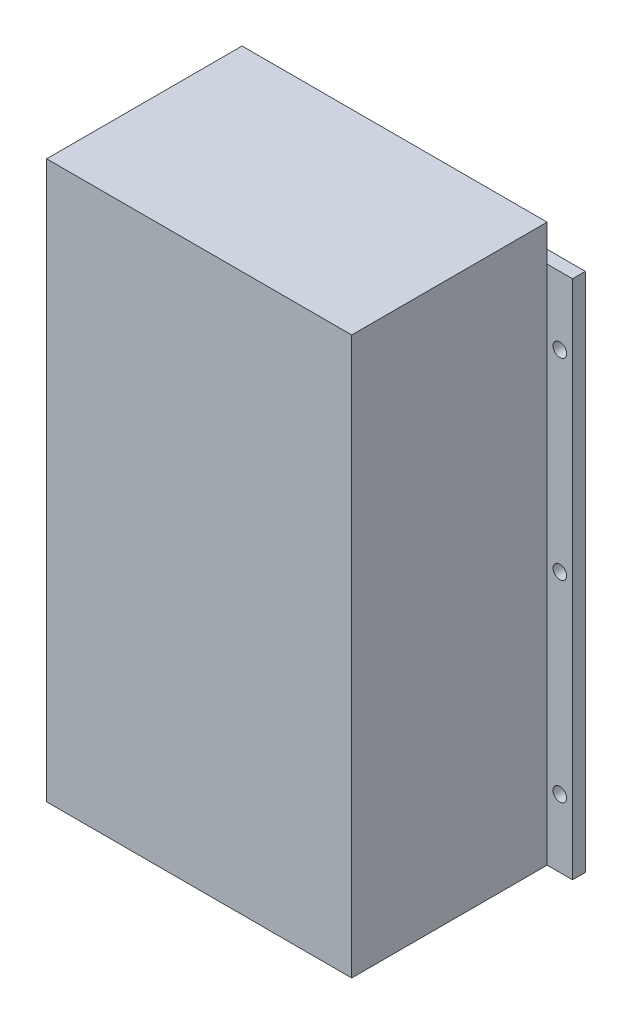
ISO-10303-21;
HEADER;
FILE_DESCRIPTION(('STEP AP214'),'2;1');
FILE_NAME('part.step','',(''),(''),'','','');
FILE_SCHEMA(('AUTOMOTIVE_DESIGN { 1 0 10303 214 1 1 1 1 }'));
ENDSEC;
DATA;
#1=APPLICATION_CONTEXT('core data for automotive mechanical design processes');
#2=APPLICATION_PROTOCOL_DEFINITION('international standard','automotive_design',2000,#1);
#3=PRODUCT_CONTEXT('',#1,'mechanical');
#4=PRODUCT('Part','Part','',(#3));
#5=PRODUCT_RELATED_PRODUCT_CATEGORY('part','',(#4));
#6=PRODUCT_DEFINITION_FORMATION('','',#4);
#7=PRODUCT_DEFINITION_CONTEXT('part definition',#1,'design');
#8=PRODUCT_DEFINITION('design','',#6,#7);
#9=PRODUCT_DEFINITION_SHAPE('','',#8);
#10=(LENGTH_UNIT() NAMED_UNIT(*) SI_UNIT(.MILLI.,.METRE.));
#11=(NAMED_UNIT(*) PLANE_ANGLE_UNIT() SI_UNIT($,.RADIAN.));
#12=(NAMED_UNIT(*) SI_UNIT($,.STERADIAN.) SOLID_ANGLE_UNIT());
#13=UNCERTAINTY_MEASURE_WITH_UNIT(LENGTH_MEASURE(1.E-05),#10,'distance_accuracy_value','');
#14=(GEOMETRIC_REPRESENTATION_CONTEXT(3) GLOBAL_UNCERTAINTY_ASSIGNED_CONTEXT((#13)) GLOBAL_UNIT_ASSIGNED_CONTEXT((#10,
#11,#12)) REPRESENTATION_CONTEXT('',''));
#15=CARTESIAN_POINT('',(0.,0.,0.));
#16=DIRECTION('',(0.,0.,1.));
#17=DIRECTION('',(1.,0.,0.));
#18=AXIS2_PLACEMENT_3D('',#15,#16,#17);
#19=CARTESIAN_POINT('',(0.,215.,86.));
#20=DIRECTION('',(0.,-1.,0.));
#21=DIRECTION('',(0.,0.,-1.));
#22=AXIS2_PLACEMENT_3D('',#19,#20,#21);
#23=PLANE('',#22);
#24=DIRECTION('',(-1.,0.,0.));
#25=VECTOR('',#24,1.);
#26=CARTESIAN_POINT('',(0.,215.,5.3));
#27=LINE('',#26,#25);
#28=CARTESIAN_POINT('',(126.,215.,5.3));
#29=VERTEX_POINT('',#28);
#30=CARTESIAN_POINT('',(0.,215.,5.3));
#31=VERTEX_POINT('',#30);
#32=EDGE_CURVE('E136',#29,#31,#27,.T.);
#33=ORIENTED_EDGE('',*,*,#32,.F.);
#34=DIRECTION('',(1.,0.,0.));
#35=VECTOR('',#34,1.);
#36=CARTESIAN_POINT('',(-10.5,215.,5.3));
#37=LINE('',#36,#35);
#38=CARTESIAN_POINT('',(136.5,215.,5.3));
#39=VERTEX_POINT('',#38);
#40=EDGE_CURVE('E233',#29,#39,#37,.T.);
#41=ORIENTED_EDGE('',*,*,#40,.T.);
#42=DIRECTION('',(0.,0.,1.));
#43=VECTOR('',#42,1.);
#44=CARTESIAN_POINT('',(136.5,215.,0.));
#45=LINE('',#44,#43);
#46=CARTESIAN_POINT('',(136.5,215.,0.));
#47=VERTEX_POINT('',#46);
#48=EDGE_CURVE('E205',#47,#39,#45,.T.);
#49=ORIENTED_EDGE('',*,*,#48,.F.);
#50=DIRECTION('',(-1.,0.,0.));
#51=VECTOR('',#50,1.);
#52=CARTESIAN_POINT('',(0.,215.,0.));
#53=LINE('',#52,#51);
#54=CARTESIAN_POINT('',(-10.5,215.,0.));
#55=VERTEX_POINT('',#54);
#56=EDGE_CURVE('E119',#47,#55,#53,.T.);
#57=ORIENTED_EDGE('',*,*,#56,.T.);
#58=DIRECTION('',(0.,0.,1.));
#59=VECTOR('',#58,1.);
#60=CARTESIAN_POINT('',(-10.5,215.,0.));
#61=LINE('',#60,#59);
#62=CARTESIAN_POINT('',(-10.5,215.,5.3));
#63=VERTEX_POINT('',#62);
#64=EDGE_CURVE('E221',#55,#63,#61,.T.);
#65=ORIENTED_EDGE('',*,*,#64,.T.);
#66=EDGE_CURVE('E240',#63,#31,#37,.T.);
#67=ORIENTED_EDGE('',*,*,#66,.T.);
#68=EDGE_LOOP('',(#33,#41,#49,#57,#65,#67));
#69=FACE_BOUND('',#68,.T.);
#70=ADVANCED_FACE('F43',(#69),#23,.F.);
#71=CARTESIAN_POINT('',(0.,0.,86.));
#72=DIRECTION('',(1.,0.,0.));
#73=DIRECTION('',(0.,0.,-1.));
#74=AXIS2_PLACEMENT_3D('',#71,#72,#73);
#75=PLANE('',#74);
#76=DIRECTION('',(0.,-1.,0.));
#77=VECTOR('',#76,1.);
#78=CARTESIAN_POINT('',(0.,0.,86.));
#79=LINE('',#78,#77);
#80=CARTESIAN_POINT('',(0.,230.,86.));
#81=VERTEX_POINT('',#80);
#82=CARTESIAN_POINT('',(0.,0.,86.));
#83=VERTEX_POINT('',#82);
#84=EDGE_CURVE('E114',#81,#83,#79,.T.);
#85=ORIENTED_EDGE('',*,*,#84,.F.);
#86=DIRECTION('',(0.,0.,1.));
#87=VECTOR('',#86,1.);
#88=CARTESIAN_POINT('',(0.,230.,5.3));
#89=LINE('',#88,#87);
#90=CARTESIAN_POINT('',(0.,230.,5.3));
#91=VERTEX_POINT('',#90);
#92=EDGE_CURVE('E117',#91,#81,#89,.T.);
#93=ORIENTED_EDGE('',*,*,#92,.F.);
#94=DIRECTION('',(0.,-1.,0.));
#95=VECTOR('',#94,1.);
#96=CARTESIAN_POINT('',(0.,230.,5.3));
#97=LINE('',#96,#95);
#98=EDGE_CURVE('E145',#91,#31,#97,.T.);
#99=ORIENTED_EDGE('',*,*,#98,.T.);
#100=DIRECTION('',(0.,-1.,0.));
#101=VECTOR('',#100,1.);
#102=CARTESIAN_POINT('',(0.,0.,5.29999999999997));
#103=LINE('',#102,#101);
#104=CARTESIAN_POINT('',(0.,0.,5.29999999999997));
#105=VERTEX_POINT('',#104);
#106=EDGE_CURVE('E59',#31,#105,#103,.T.);
#107=ORIENTED_EDGE('',*,*,#106,.T.);
#108=DIRECTION('',(0.,0.,-1.));
#109=VECTOR('',#108,1.);
#110=CARTESIAN_POINT('',(0.,0.,86.));
#111=LINE('',#110,#109);
#112=EDGE_CURVE('E11',#83,#105,#111,.T.);
#113=ORIENTED_EDGE('',*,*,#112,.F.);
#114=EDGE_LOOP('',(#85,#93,#99,#107,#113));
#115=FACE_BOUND('',#114,.T.);
#116=ADVANCED_FACE('F45',(#115),#75,.F.);
#117=CARTESIAN_POINT('',(0.,0.,86.));
#118=DIRECTION('',(0.,1.,0.));
#119=DIRECTION('',(0.,0.,1.));
#120=AXIS2_PLACEMENT_3D('',#117,#118,#119);
#121=PLANE('',#120);
#122=ORIENTED_EDGE('',*,*,#112,.T.);
#123=DIRECTION('',(1.,0.,0.));
#124=VECTOR('',#123,1.);
#125=CARTESIAN_POINT('',(-10.5,0.,5.29999999999997));
#126=LINE('',#125,#124);
#127=CARTESIAN_POINT('',(-10.5,0.,5.29999999999997));
#128=VERTEX_POINT('',#127);
#129=EDGE_CURVE('E234',#128,#105,#126,.T.);
#130=ORIENTED_EDGE('',*,*,#129,.F.);
#131=DIRECTION('',(0.,0.,-1.));
#132=VECTOR('',#131,1.);
#133=CARTESIAN_POINT('',(-10.5,0.,0.));
#134=LINE('',#133,#132);
#135=CARTESIAN_POINT('',(-10.5,0.,0.));
#136=VERTEX_POINT('',#135);
#137=EDGE_CURVE('E229',#128,#136,#134,.T.);
#138=ORIENTED_EDGE('',*,*,#137,.T.);
#139=DIRECTION('',(1.,0.,0.));
#140=VECTOR('',#139,1.);
#141=CARTESIAN_POINT('',(0.,0.,0.));
#142=LINE('',#141,#140);
#143=CARTESIAN_POINT('',(136.5,0.,0.));
#144=VERTEX_POINT('',#143);
#145=EDGE_CURVE('E247',#136,#144,#142,.T.);
#146=ORIENTED_EDGE('',*,*,#145,.T.);
#147=DIRECTION('',(0.,0.,-1.));
#148=VECTOR('',#147,1.);
#149=CARTESIAN_POINT('',(136.5,0.,0.));
#150=LINE('',#149,#148);
#151=CARTESIAN_POINT('',(136.5,0.,5.29999999999997));
#152=VERTEX_POINT('',#151);
#153=EDGE_CURVE('E213',#152,#144,#150,.T.);
#154=ORIENTED_EDGE('',*,*,#153,.F.);
#155=CARTESIAN_POINT('',(126.,0.,5.29999999999997));
#156=VERTEX_POINT('',#155);
#157=EDGE_CURVE('E239',#156,#152,#126,.T.);
#158=ORIENTED_EDGE('',*,*,#157,.F.);
#159=DIRECTION('',(0.,0.,-1.));
#160=VECTOR('',#159,1.);
#161=CARTESIAN_POINT('',(126.,0.,86.));
#162=LINE('',#161,#160);
#163=CARTESIAN_POINT('',(126.,0.,86.));
#164=VERTEX_POINT('',#163);
#165=EDGE_CURVE('E52',#164,#156,#162,.T.);
#166=ORIENTED_EDGE('',*,*,#165,.F.);
#167=DIRECTION('',(1.,0.,0.));
#168=VECTOR('',#167,1.);
#169=CARTESIAN_POINT('',(0.,0.,86.));
#170=LINE('',#169,#168);
#171=EDGE_CURVE('E66',#83,#164,#170,.T.);
#172=ORIENTED_EDGE('',*,*,#171,.F.);
#173=EDGE_LOOP('',(#122,#130,#138,#146,#154,#158,#166,#172));
#174=FACE_BOUND('',#173,.T.);
#175=ADVANCED_FACE('F263',(#174),#121,.F.);
#176=CARTESIAN_POINT('',(126.,0.,86.));
#177=DIRECTION('',(-1.,0.,0.));
#178=DIRECTION('',(0.,0.,1.));
#179=AXIS2_PLACEMENT_3D('',#176,#177,#178);
#180=PLANE('',#179);
#181=ORIENTED_EDGE('',*,*,#165,.T.);
#182=DIRECTION('',(0.,1.,0.));
#183=VECTOR('',#182,1.);
#184=CARTESIAN_POINT('',(126.,0.,5.29999999999997));
#185=LINE('',#184,#183);
#186=EDGE_CURVE('E238',#156,#29,#185,.T.);
#187=ORIENTED_EDGE('',*,*,#186,.T.);
#188=DIRECTION('',(0.,-1.,0.));
#189=VECTOR('',#188,1.);
#190=CARTESIAN_POINT('',(126.,230.,5.3));
#191=LINE('',#190,#189);
#192=CARTESIAN_POINT('',(126.,230.,5.3));
#193=VERTEX_POINT('',#192);
#194=EDGE_CURVE('E149',#193,#29,#191,.T.);
#195=ORIENTED_EDGE('',*,*,#194,.F.);
#196=DIRECTION('',(0.,0.,-1.));
#197=VECTOR('',#196,1.);
#198=CARTESIAN_POINT('',(126.,230.,5.3));
#199=LINE('',#198,#197);
#200=CARTESIAN_POINT('',(126.,230.,86.));
#201=VERTEX_POINT('',#200);
#202=EDGE_CURVE('E129',#201,#193,#199,.T.);
#203=ORIENTED_EDGE('',*,*,#202,.F.);
#204=DIRECTION('',(0.,1.,0.));
#205=VECTOR('',#204,1.);
#206=CARTESIAN_POINT('',(126.,0.,86.));
#207=LINE('',#206,#205);
#208=EDGE_CURVE('E125',#164,#201,#207,.T.);
#209=ORIENTED_EDGE('',*,*,#208,.F.);
#210=EDGE_LOOP('',(#181,#187,#195,#203,#209));
#211=FACE_BOUND('',#210,.T.);
#212=ADVANCED_FACE('F259',(#211),#180,.F.);
#213=CARTESIAN_POINT('',(0.,0.,86.));
#214=DIRECTION('',(0.,0.,-1.));
#215=DIRECTION('',(-1.,0.,0.));
#216=AXIS2_PLACEMENT_3D('',#213,#214,#215);
#217=PLANE('',#216);
#218=ORIENTED_EDGE('',*,*,#84,.T.);
#219=ORIENTED_EDGE('',*,*,#171,.T.);
#220=ORIENTED_EDGE('',*,*,#208,.T.);
#221=DIRECTION('',(1.,0.,0.));
#222=VECTOR('',#221,1.);
#223=CARTESIAN_POINT('',(0.,230.,86.));
#224=LINE('',#223,#222);
#225=EDGE_CURVE('E122',#81,#201,#224,.T.);
#226=ORIENTED_EDGE('',*,*,#225,.F.);
#227=EDGE_LOOP('',(#218,#219,#220,#226));
#228=FACE_BOUND('',#227,.T.);
#229=ADVANCED_FACE('F123',(#228),#217,.F.);
#230=CARTESIAN_POINT('',(0.,0.,0.));
#231=DIRECTION('',(0.,0.,-1.));
#232=DIRECTION('',(-1.,0.,0.));
#233=AXIS2_PLACEMENT_3D('',#230,#231,#232);
#234=PLANE('',#233);
#235=CARTESIAN_POINT('',(-5.25,187.,0.));
#236=DIRECTION('',(0.,0.,-1.));
#237=DIRECTION('',(-1.,0.,0.));
#238=AXIS2_PLACEMENT_3D('',#235,#236,#237);
#239=CIRCLE('',#238,2.8);
#240=CARTESIAN_POINT('',(-2.45,187.,0.));
#241=VERTEX_POINT('',#240);
#242=EDGE_CURVE('E157',#241,#241,#239,.T.);
#243=ORIENTED_EDGE('',*,*,#242,.F.);
#244=EDGE_LOOP('',(#243));
#245=FACE_BOUND('',#244,.T.);
#246=CARTESIAN_POINT('',(-5.25,107.5,0.));
#247=DIRECTION('',(0.,0.,-1.));
#248=DIRECTION('',(-1.,0.,0.));
#249=AXIS2_PLACEMENT_3D('',#246,#247,#248);
#250=CIRCLE('',#249,2.8);
#251=CARTESIAN_POINT('',(-2.45,107.5,0.));
#252=VERTEX_POINT('',#251);
#253=EDGE_CURVE('E161',#252,#252,#250,.T.);
#254=ORIENTED_EDGE('',*,*,#253,.F.);
#255=EDGE_LOOP('',(#254));
#256=FACE_BOUND('',#255,.T.);
#257=CARTESIAN_POINT('',(-5.25,28.,0.));
#258=DIRECTION('',(0.,0.,-1.));
#259=DIRECTION('',(-1.,0.,0.));
#260=AXIS2_PLACEMENT_3D('',#257,#258,#259);
#261=CIRCLE('',#260,2.80000000000001);
#262=CARTESIAN_POINT('',(-2.45,28.,0.));
#263=VERTEX_POINT('',#262);
#264=EDGE_CURVE('E173',#263,#263,#261,.T.);
#265=ORIENTED_EDGE('',*,*,#264,.F.);
#266=EDGE_LOOP('',(#265));
#267=FACE_BOUND('',#266,.T.);
#268=CARTESIAN_POINT('',(131.25,187.,0.));
#269=DIRECTION('',(0.,0.,-1.));
#270=DIRECTION('',(-1.,0.,0.));
#271=AXIS2_PLACEMENT_3D('',#268,#269,#270);
#272=CIRCLE('',#271,2.8);
#273=CARTESIAN_POINT('',(134.05,187.,0.));
#274=VERTEX_POINT('',#273);
#275=EDGE_CURVE('E181',#274,#274,#272,.T.);
#276=ORIENTED_EDGE('',*,*,#275,.F.);
#277=EDGE_LOOP('',(#276));
#278=FACE_BOUND('',#277,.T.);
#279=CARTESIAN_POINT('',(131.25,107.5,0.));
#280=DIRECTION('',(0.,0.,-1.));
#281=DIRECTION('',(-1.,0.,0.));
#282=AXIS2_PLACEMENT_3D('',#279,#280,#281);
#283=CIRCLE('',#282,2.8);
#284=CARTESIAN_POINT('',(134.05,107.5,0.));
#285=VERTEX_POINT('',#284);
#286=EDGE_CURVE('E189',#285,#285,#283,.T.);
#287=ORIENTED_EDGE('',*,*,#286,.F.);
#288=EDGE_LOOP('',(#287));
#289=FACE_BOUND('',#288,.T.);
#290=CARTESIAN_POINT('',(131.25,28.,0.));
#291=DIRECTION('',(0.,0.,-1.));
#292=DIRECTION('',(-1.,0.,0.));
#293=AXIS2_PLACEMENT_3D('',#290,#291,#292);
#294=CIRCLE('',#293,2.80000000000001);
#295=CARTESIAN_POINT('',(134.05,28.,0.));
#296=VERTEX_POINT('',#295);
#297=EDGE_CURVE('E197',#296,#296,#294,.T.);
#298=ORIENTED_EDGE('',*,*,#297,.F.);
#299=EDGE_LOOP('',(#298));
#300=FACE_BOUND('',#299,.T.);
#301=ORIENTED_EDGE('',*,*,#145,.F.);
#302=DIRECTION('',(0.,1.,0.));
#303=VECTOR('',#302,1.);
#304=CARTESIAN_POINT('',(-10.5,215.,0.));
#305=LINE('',#304,#303);
#306=EDGE_CURVE('E217',#136,#55,#305,.T.);
#307=ORIENTED_EDGE('',*,*,#306,.T.);
#308=ORIENTED_EDGE('',*,*,#56,.F.);
#309=DIRECTION('',(0.,1.,0.));
#310=VECTOR('',#309,1.);
#311=CARTESIAN_POINT('',(136.5,215.,0.));
#312=LINE('',#311,#310);
#313=EDGE_CURVE('E201',#144,#47,#312,.T.);
#314=ORIENTED_EDGE('',*,*,#313,.F.);
#315=EDGE_LOOP('',(#301,#307,#308,#314));
#316=FACE_BOUND('',#315,.T.);
#317=ADVANCED_FACE('F286',(#245,#256,#267,#278,#289,#300,#316),#234,.T.);
#318=CARTESIAN_POINT('',(136.5,0.,0.));
#319=DIRECTION('',(-1.,0.,0.));
#320=DIRECTION('',(0.,0.,1.));
#321=AXIS2_PLACEMENT_3D('',#318,#319,#320);
#322=PLANE('',#321);
#323=ORIENTED_EDGE('',*,*,#313,.T.);
#324=ORIENTED_EDGE('',*,*,#48,.T.);
#325=DIRECTION('',(0.,-1.,0.));
#326=VECTOR('',#325,1.);
#327=CARTESIAN_POINT('',(136.5,215.,5.3));
#328=LINE('',#327,#326);
#329=EDGE_CURVE('E209',#39,#152,#328,.T.);
#330=ORIENTED_EDGE('',*,*,#329,.T.);
#331=ORIENTED_EDGE('',*,*,#153,.T.);
#332=EDGE_LOOP('',(#323,#324,#330,#331));
#333=FACE_BOUND('',#332,.T.);
#334=ADVANCED_FACE('F273',(#333),#322,.F.);
#335=CARTESIAN_POINT('',(-10.5,215.,5.3));
#336=DIRECTION('',(0.,0.,1.));
#337=DIRECTION('',(0.,-1.,0.));
#338=AXIS2_PLACEMENT_3D('',#335,#336,#337);
#339=PLANE('',#338);
#340=CARTESIAN_POINT('',(131.25,187.,5.29999999999997));
#341=DIRECTION('',(0.,0.,1.));
#342=DIRECTION('',(1.,0.,0.));
#343=AXIS2_PLACEMENT_3D('',#340,#341,#342);
#344=CIRCLE('',#343,2.8);
#345=CARTESIAN_POINT('',(134.05,187.,5.29999999999997));
#346=VERTEX_POINT('',#345);
#347=EDGE_CURVE('E177',#346,#346,#344,.T.);
#348=ORIENTED_EDGE('',*,*,#347,.F.);
#349=EDGE_LOOP('',(#348));
#350=FACE_BOUND('',#349,.T.);
#351=CARTESIAN_POINT('',(131.25,107.5,5.29999999999997));
#352=DIRECTION('',(0.,0.,1.));
#353=DIRECTION('',(1.,0.,0.));
#354=AXIS2_PLACEMENT_3D('',#351,#352,#353);
#355=CIRCLE('',#354,2.8);
#356=CARTESIAN_POINT('',(134.05,107.5,5.29999999999997));
#357=VERTEX_POINT('',#356);
#358=EDGE_CURVE('E185',#357,#357,#355,.T.);
#359=ORIENTED_EDGE('',*,*,#358,.F.);
#360=EDGE_LOOP('',(#359));
#361=FACE_BOUND('',#360,.T.);
#362=CARTESIAN_POINT('',(131.25,28.,5.29999999999997));
#363=DIRECTION('',(0.,0.,1.));
#364=DIRECTION('',(1.,0.,0.));
#365=AXIS2_PLACEMENT_3D('',#362,#363,#364);
#366=CIRCLE('',#365,2.80000000000001);
#367=CARTESIAN_POINT('',(134.05,28.,5.29999999999997));
#368=VERTEX_POINT('',#367);
#369=EDGE_CURVE('E193',#368,#368,#366,.T.);
#370=ORIENTED_EDGE('',*,*,#369,.F.);
#371=EDGE_LOOP('',(#370));
#372=FACE_BOUND('',#371,.T.);
#373=ORIENTED_EDGE('',*,*,#186,.F.);
#374=ORIENTED_EDGE('',*,*,#157,.T.);
#375=ORIENTED_EDGE('',*,*,#329,.F.);
#376=ORIENTED_EDGE('',*,*,#40,.F.);
#377=EDGE_LOOP('',(#373,#374,#375,#376));
#378=FACE_BOUND('',#377,.T.);
#379=ADVANCED_FACE('F275',(#350,#361,#372,#378),#339,.T.);
#380=CARTESIAN_POINT('',(-5.25,187.,5.29999999999997));
#381=DIRECTION('',(0.,0.,1.));
#382=DIRECTION('',(1.,0.,0.));
#383=AXIS2_PLACEMENT_3D('',#380,#381,#382);
#384=CIRCLE('',#383,2.8);
#385=CARTESIAN_POINT('',(-2.45,187.,5.29999999999997));
#386=VERTEX_POINT('',#385);
#387=EDGE_CURVE('E153',#386,#386,#384,.T.);
#388=ORIENTED_EDGE('',*,*,#387,.F.);
#389=EDGE_LOOP('',(#388));
#390=FACE_BOUND('',#389,.T.);
#391=CARTESIAN_POINT('',(-5.25,107.5,5.29999999999997));
#392=DIRECTION('',(0.,0.,1.));
#393=DIRECTION('',(1.,0.,0.));
#394=AXIS2_PLACEMENT_3D('',#391,#392,#393);
#395=CIRCLE('',#394,2.8);
#396=CARTESIAN_POINT('',(-2.45,107.5,5.29999999999997));
#397=VERTEX_POINT('',#396);
#398=EDGE_CURVE('E165',#397,#397,#395,.T.);
#399=ORIENTED_EDGE('',*,*,#398,.F.);
#400=EDGE_LOOP('',(#399));
#401=FACE_BOUND('',#400,.T.);
#402=CARTESIAN_POINT('',(-5.25,28.,5.29999999999997));
#403=DIRECTION('',(0.,0.,1.));
#404=DIRECTION('',(1.,0.,0.));
#405=AXIS2_PLACEMENT_3D('',#402,#403,#404);
#406=CIRCLE('',#405,2.80000000000001);
#407=CARTESIAN_POINT('',(-2.45,28.,5.29999999999997));
#408=VERTEX_POINT('',#407);
#409=EDGE_CURVE('E169',#408,#408,#406,.T.);
#410=ORIENTED_EDGE('',*,*,#409,.F.);
#411=EDGE_LOOP('',(#410));
#412=FACE_BOUND('',#411,.T.);
#413=ORIENTED_EDGE('',*,*,#106,.F.);
#414=ORIENTED_EDGE('',*,*,#66,.F.);
#415=DIRECTION('',(0.,-1.,0.));
#416=VECTOR('',#415,1.);
#417=CARTESIAN_POINT('',(-10.5,215.,5.3));
#418=LINE('',#417,#416);
#419=EDGE_CURVE('E225',#63,#128,#418,.T.);
#420=ORIENTED_EDGE('',*,*,#419,.T.);
#421=ORIENTED_EDGE('',*,*,#129,.T.);
#422=EDGE_LOOP('',(#413,#414,#420,#421));
#423=FACE_BOUND('',#422,.T.);
#424=ADVANCED_FACE('F277',(#390,#401,#412,#423),#339,.T.);
#425=CARTESIAN_POINT('',(-10.5,0.,0.));
#426=DIRECTION('',(-1.,0.,0.));
#427=DIRECTION('',(0.,0.,1.));
#428=AXIS2_PLACEMENT_3D('',#425,#426,#427);
#429=PLANE('',#428);
#430=ORIENTED_EDGE('',*,*,#306,.F.);
#431=ORIENTED_EDGE('',*,*,#137,.F.);
#432=ORIENTED_EDGE('',*,*,#419,.F.);
#433=ORIENTED_EDGE('',*,*,#64,.F.);
#434=EDGE_LOOP('',(#430,#431,#432,#433));
#435=FACE_BOUND('',#434,.T.);
#436=ADVANCED_FACE('F284',(#435),#429,.T.);
#437=CARTESIAN_POINT('',(131.25,28.,-5.20000000000003));
#438=DIRECTION('',(0.,0.,1.));
#439=DIRECTION('',(1.,0.,0.));
#440=AXIS2_PLACEMENT_3D('',#437,#438,#439);
#441=CYLINDRICAL_SURFACE('',#440,2.80000000000001);
#442=CARTESIAN_POINT('',(134.05,28.,0.));
#443=CARTESIAN_POINT('',(134.05,28.,0.055208333333333));
#444=CARTESIAN_POINT('',(134.05,28.,0.110416666666666));
#445=CARTESIAN_POINT('',(134.05,28.,0.220833333333332));
#446=CARTESIAN_POINT('',(134.05,28.,0.276041666666665));
#447=CARTESIAN_POINT('',(134.05,28.,0.386458333333331));
#448=CARTESIAN_POINT('',(134.05,28.,0.441666666666664));
#449=CARTESIAN_POINT('',(134.05,28.,0.55208333333333));
#450=CARTESIAN_POINT('',(134.05,28.,0.607291666666663));
#451=CARTESIAN_POINT('',(134.05,28.,0.71770833333333));
#452=CARTESIAN_POINT('',(134.05,28.,0.772916666666663));
#453=CARTESIAN_POINT('',(134.05,28.,0.883333333333329));
#454=CARTESIAN_POINT('',(134.05,28.,0.938541666666662));
#455=CARTESIAN_POINT('',(134.05,28.,1.04895833333333));
#456=CARTESIAN_POINT('',(134.05,28.,1.10416666666666));
#457=CARTESIAN_POINT('',(134.05,28.,1.21458333333333));
#458=CARTESIAN_POINT('',(134.05,28.,1.26979166666666));
#459=CARTESIAN_POINT('',(134.05,28.,1.38020833333333));
#460=CARTESIAN_POINT('',(134.05,28.,1.43541666666666));
#461=CARTESIAN_POINT('',(134.05,28.,1.54583333333333));
#462=CARTESIAN_POINT('',(134.05,28.,1.60104166666666));
#463=CARTESIAN_POINT('',(134.05,28.,1.71145833333333));
#464=CARTESIAN_POINT('',(134.05,28.,1.76666666666666));
#465=CARTESIAN_POINT('',(134.05,28.,1.87708333333332));
#466=CARTESIAN_POINT('',(134.05,28.,1.93229166666666));
#467=CARTESIAN_POINT('',(134.05,28.,2.04270833333332));
#468=CARTESIAN_POINT('',(134.05,28.,2.09791666666666));
#469=CARTESIAN_POINT('',(134.05,28.,2.20833333333332));
#470=CARTESIAN_POINT('',(134.05,28.,2.26354166666666));
#471=CARTESIAN_POINT('',(134.05,28.,2.37395833333332));
#472=CARTESIAN_POINT('',(134.05,28.,2.42916666666666));
#473=CARTESIAN_POINT('',(134.05,28.,2.53958333333332));
#474=CARTESIAN_POINT('',(134.05,28.,2.59479166666665));
#475=CARTESIAN_POINT('',(134.05,28.,2.70520833333332));
#476=CARTESIAN_POINT('',(134.05,28.,2.76041666666665));
#477=CARTESIAN_POINT('',(134.05,28.,2.87083333333332));
#478=CARTESIAN_POINT('',(134.05,28.,2.92604166666665));
#479=CARTESIAN_POINT('',(134.05,28.,3.03645833333332));
#480=CARTESIAN_POINT('',(134.05,28.,3.09166666666665));
#481=CARTESIAN_POINT('',(134.05,28.,3.20208333333332));
#482=CARTESIAN_POINT('',(134.05,28.,3.25729166666665));
#483=CARTESIAN_POINT('',(134.05,28.,3.36770833333332));
#484=CARTESIAN_POINT('',(134.05,28.,3.42291666666665));
#485=CARTESIAN_POINT('',(134.05,28.,3.53333333333332));
#486=CARTESIAN_POINT('',(134.05,28.,3.58854166666665));
#487=CARTESIAN_POINT('',(134.05,28.,3.69895833333332));
#488=CARTESIAN_POINT('',(134.05,28.,3.75416666666665));
#489=CARTESIAN_POINT('',(134.05,28.,3.86458333333331));
#490=CARTESIAN_POINT('',(134.05,28.,3.91979166666665));
#491=CARTESIAN_POINT('',(134.05,28.,4.03020833333331));
#492=CARTESIAN_POINT('',(134.05,28.,4.08541666666665));
#493=CARTESIAN_POINT('',(134.05,28.,4.19583333333331));
#494=CARTESIAN_POINT('',(134.05,28.,4.25104166666665));
#495=CARTESIAN_POINT('',(134.05,28.,4.36145833333331));
#496=CARTESIAN_POINT('',(134.05,28.,4.41666666666664));
#497=CARTESIAN_POINT('',(134.05,28.,4.52708333333331));
#498=CARTESIAN_POINT('',(134.05,28.,4.58229166666664));
#499=CARTESIAN_POINT('',(134.05,28.,4.69270833333331));
#500=CARTESIAN_POINT('',(134.05,28.,4.74791666666664));
#501=CARTESIAN_POINT('',(134.05,28.,4.85833333333331));
#502=CARTESIAN_POINT('',(134.05,28.,4.91354166666664));
#503=CARTESIAN_POINT('',(134.05,28.,5.02395833333331));
#504=CARTESIAN_POINT('',(134.05,28.,5.07916666666664));
#505=CARTESIAN_POINT('',(134.05,28.,5.18958333333331));
#506=CARTESIAN_POINT('',(134.05,28.,5.24479166666664));
#507=CARTESIAN_POINT('',(134.05,28.,5.29999999999997));
#508=B_SPLINE_CURVE_WITH_KNOTS('',3,(#442,#443,#444,#445,#446,#447,#448,#449,#450,#451,#452,
#453,#454,#455,#456,#457,#458,#459,#460,#461,#462,#463,#464,#465,#466,#467,#468,#469,#470,#471,
#472,#473,#474,#475,#476,#477,#478,#479,#480,#481,#482,#483,#484,#485,#486,#487,#488,#489,#490,
#491,#492,#493,#494,#495,#496,#497,#498,#499,#500,#501,#502,#503,#504,#505,#506,#507),
.UNSPECIFIED.,.F.,.F.,(4,2,2,2,2,2,2,2,2,2,2,2,2,2,2,2,2,2,2,2,2,2,2,2,2,2,2,2,2,2,2,2,4),(0.,
0.165624999999999,0.331249999999998,0.496874999999997,0.662499999999996,0.828124999999996,
0.993749999999995,1.15937499999999,1.32499999999999,1.49062499999999,1.65624999999999,
1.82187499999999,1.98749999999999,2.15312499999999,2.31874999999999,2.48437499999999,
2.64999999999999,2.81562499999999,2.98124999999998,3.14687499999998,3.31249999999998,
3.47812499999998,3.64374999999998,3.80937499999998,3.97499999999998,4.14062499999998,
4.30624999999998,4.47187499999998,4.63749999999998,4.80312499999998,4.96874999999998,
5.13437499999997,5.29999999999997),.UNSPECIFIED.);
#509=EDGE_CURVE('BSEAM337',#296,#368,#508,.T.);
#510=ORIENTED_EDGE('',*,*,#297,.T.);
#511=ORIENTED_EDGE('',*,*,#369,.T.);
#512=ORIENTED_EDGE('',*,*,#509,.T.);
#513=ORIENTED_EDGE('',*,*,#509,.F.);
#514=EDGE_LOOP('',(#510,#512,#511,#513));
#515=FACE_BOUND('',#514,.T.);
#516=ADVANCED_FACE('F337',(#515),#441,.F.);
#517=CARTESIAN_POINT('',(131.25,107.5,-5.20000000000003));
#518=DIRECTION('',(0.,0.,1.));
#519=DIRECTION('',(1.,0.,0.));
#520=AXIS2_PLACEMENT_3D('',#517,#518,#519);
#521=CYLINDRICAL_SURFACE('',#520,2.8);
#522=CARTESIAN_POINT('',(134.05,107.5,0.));
#523=CARTESIAN_POINT('',(134.05,107.5,0.055208333333333));
#524=CARTESIAN_POINT('',(134.05,107.5,0.110416666666666));
#525=CARTESIAN_POINT('',(134.05,107.5,0.220833333333332));
#526=CARTESIAN_POINT('',(134.05,107.5,0.276041666666665));
#527=CARTESIAN_POINT('',(134.05,107.5,0.386458333333331));
#528=CARTESIAN_POINT('',(134.05,107.5,0.441666666666664));
#529=CARTESIAN_POINT('',(134.05,107.5,0.55208333333333));
#530=CARTESIAN_POINT('',(134.05,107.5,0.607291666666663));
#531=CARTESIAN_POINT('',(134.05,107.5,0.71770833333333));
#532=CARTESIAN_POINT('',(134.05,107.5,0.772916666666663));
#533=CARTESIAN_POINT('',(134.05,107.5,0.883333333333329));
#534=CARTESIAN_POINT('',(134.05,107.5,0.938541666666662));
#535=CARTESIAN_POINT('',(134.05,107.5,1.04895833333333));
#536=CARTESIAN_POINT('',(134.05,107.5,1.10416666666666));
#537=CARTESIAN_POINT('',(134.05,107.5,1.21458333333333));
#538=CARTESIAN_POINT('',(134.05,107.5,1.26979166666666));
#539=CARTESIAN_POINT('',(134.05,107.5,1.38020833333333));
#540=CARTESIAN_POINT('',(134.05,107.5,1.43541666666666));
#541=CARTESIAN_POINT('',(134.05,107.5,1.54583333333333));
#542=CARTESIAN_POINT('',(134.05,107.5,1.60104166666666));
#543=CARTESIAN_POINT('',(134.05,107.5,1.71145833333333));
#544=CARTESIAN_POINT('',(134.05,107.5,1.76666666666666));
#545=CARTESIAN_POINT('',(134.05,107.5,1.87708333333332));
#546=CARTESIAN_POINT('',(134.05,107.5,1.93229166666666));
#547=CARTESIAN_POINT('',(134.05,107.5,2.04270833333332));
#548=CARTESIAN_POINT('',(134.05,107.5,2.09791666666666));
#549=CARTESIAN_POINT('',(134.05,107.5,2.20833333333332));
#550=CARTESIAN_POINT('',(134.05,107.5,2.26354166666666));
#551=CARTESIAN_POINT('',(134.05,107.5,2.37395833333332));
#552=CARTESIAN_POINT('',(134.05,107.5,2.42916666666666));
#553=CARTESIAN_POINT('',(134.05,107.5,2.53958333333332));
#554=CARTESIAN_POINT('',(134.05,107.5,2.59479166666665));
#555=CARTESIAN_POINT('',(134.05,107.5,2.70520833333332));
#556=CARTESIAN_POINT('',(134.05,107.5,2.76041666666665));
#557=CARTESIAN_POINT('',(134.05,107.5,2.87083333333332));
#558=CARTESIAN_POINT('',(134.05,107.5,2.92604166666665));
#559=CARTESIAN_POINT('',(134.05,107.5,3.03645833333332));
#560=CARTESIAN_POINT('',(134.05,107.5,3.09166666666665));
#561=CARTESIAN_POINT('',(134.05,107.5,3.20208333333332));
#562=CARTESIAN_POINT('',(134.05,107.5,3.25729166666665));
#563=CARTESIAN_POINT('',(134.05,107.5,3.36770833333332));
#564=CARTESIAN_POINT('',(134.05,107.5,3.42291666666665));
#565=CARTESIAN_POINT('',(134.05,107.5,3.53333333333332));
#566=CARTESIAN_POINT('',(134.05,107.5,3.58854166666665));
#567=CARTESIAN_POINT('',(134.05,107.5,3.69895833333332));
#568=CARTESIAN_POINT('',(134.05,107.5,3.75416666666665));
#569=CARTESIAN_POINT('',(134.05,107.5,3.86458333333331));
#570=CARTESIAN_POINT('',(134.05,107.5,3.91979166666665));
#571=CARTESIAN_POINT('',(134.05,107.5,4.03020833333331));
#572=CARTESIAN_POINT('',(134.05,107.5,4.08541666666665));
#573=CARTESIAN_POINT('',(134.05,107.5,4.19583333333331));
#574=CARTESIAN_POINT('',(134.05,107.5,4.25104166666665));
#575=CARTESIAN_POINT('',(134.05,107.5,4.36145833333331));
#576=CARTESIAN_POINT('',(134.05,107.5,4.41666666666664));
#577=CARTESIAN_POINT('',(134.05,107.5,4.52708333333331));
#578=CARTESIAN_POINT('',(134.05,107.5,4.58229166666664));
#579=CARTESIAN_POINT('',(134.05,107.5,4.69270833333331));
#580=CARTESIAN_POINT('',(134.05,107.5,4.74791666666664));
#581=CARTESIAN_POINT('',(134.05,107.5,4.85833333333331));
#582=CARTESIAN_POINT('',(134.05,107.5,4.91354166666664));
#583=CARTESIAN_POINT('',(134.05,107.5,5.02395833333331));
#584=CARTESIAN_POINT('',(134.05,107.5,5.07916666666664));
#585=CARTESIAN_POINT('',(134.05,107.5,5.18958333333331));
#586=CARTESIAN_POINT('',(134.05,107.5,5.24479166666664));
#587=CARTESIAN_POINT('',(134.05,107.5,5.29999999999997));
#588=B_SPLINE_CURVE_WITH_KNOTS('',3,(#522,#523,#524,#525,#526,#527,#528,#529,#530,#531,#532,
#533,#534,#535,#536,#537,#538,#539,#540,#541,#542,#543,#544,#545,#546,#547,#548,#549,#550,#551,
#552,#553,#554,#555,#556,#557,#558,#559,#560,#561,#562,#563,#564,#565,#566,#567,#568,#569,#570,
#571,#572,#573,#574,#575,#576,#577,#578,#579,#580,#581,#582,#583,#584,#585,#586,#587),
.UNSPECIFIED.,.F.,.F.,(4,2,2,2,2,2,2,2,2,2,2,2,2,2,2,2,2,2,2,2,2,2,2,2,2,2,2,2,2,2,2,2,4),(0.,
0.165624999999999,0.331249999999998,0.496874999999997,0.662499999999996,0.828124999999996,
0.993749999999995,1.15937499999999,1.32499999999999,1.49062499999999,1.65624999999999,
1.82187499999999,1.98749999999999,2.15312499999999,2.31874999999999,2.48437499999999,
2.64999999999999,2.81562499999999,2.98124999999998,3.14687499999998,3.31249999999998,
3.47812499999998,3.64374999999998,3.80937499999998,3.97499999999998,4.14062499999998,
4.30624999999998,4.47187499999998,4.63749999999998,4.80312499999998,4.96874999999998,
5.13437499999997,5.29999999999997),.UNSPECIFIED.);
#589=EDGE_CURVE('BSEAM348',#285,#357,#588,.T.);
#590=ORIENTED_EDGE('',*,*,#286,.T.);
#591=ORIENTED_EDGE('',*,*,#358,.T.);
#592=ORIENTED_EDGE('',*,*,#589,.T.);
#593=ORIENTED_EDGE('',*,*,#589,.F.);
#594=EDGE_LOOP('',(#590,#592,#591,#593));
#595=FACE_BOUND('',#594,.T.);
#596=ADVANCED_FACE('F348',(#595),#521,.F.);
#597=CARTESIAN_POINT('',(131.25,187.,-5.20000000000003));
#598=DIRECTION('',(0.,0.,1.));
#599=DIRECTION('',(1.,0.,0.));
#600=AXIS2_PLACEMENT_3D('',#597,#598,#599);
#601=CYLINDRICAL_SURFACE('',#600,2.8);
#602=CARTESIAN_POINT('',(134.05,187.,0.));
#603=CARTESIAN_POINT('',(134.05,187.,0.055208333333333));
#604=CARTESIAN_POINT('',(134.05,187.,0.110416666666666));
#605=CARTESIAN_POINT('',(134.05,187.,0.220833333333332));
#606=CARTESIAN_POINT('',(134.05,187.,0.276041666666665));
#607=CARTESIAN_POINT('',(134.05,187.,0.386458333333331));
#608=CARTESIAN_POINT('',(134.05,187.,0.441666666666664));
#609=CARTESIAN_POINT('',(134.05,187.,0.55208333333333));
#610=CARTESIAN_POINT('',(134.05,187.,0.607291666666663));
#611=CARTESIAN_POINT('',(134.05,187.,0.71770833333333));
#612=CARTESIAN_POINT('',(134.05,187.,0.772916666666663));
#613=CARTESIAN_POINT('',(134.05,187.,0.883333333333329));
#614=CARTESIAN_POINT('',(134.05,187.,0.938541666666662));
#615=CARTESIAN_POINT('',(134.05,187.,1.04895833333333));
#616=CARTESIAN_POINT('',(134.05,187.,1.10416666666666));
#617=CARTESIAN_POINT('',(134.05,187.,1.21458333333333));
#618=CARTESIAN_POINT('',(134.05,187.,1.26979166666666));
#619=CARTESIAN_POINT('',(134.05,187.,1.38020833333333));
#620=CARTESIAN_POINT('',(134.05,187.,1.43541666666666));
#621=CARTESIAN_POINT('',(134.05,187.,1.54583333333333));
#622=CARTESIAN_POINT('',(134.05,187.,1.60104166666666));
#623=CARTESIAN_POINT('',(134.05,187.,1.71145833333333));
#624=CARTESIAN_POINT('',(134.05,187.,1.76666666666666));
#625=CARTESIAN_POINT('',(134.05,187.,1.87708333333332));
#626=CARTESIAN_POINT('',(134.05,187.,1.93229166666666));
#627=CARTESIAN_POINT('',(134.05,187.,2.04270833333332));
#628=CARTESIAN_POINT('',(134.05,187.,2.09791666666666));
#629=CARTESIAN_POINT('',(134.05,187.,2.20833333333332));
#630=CARTESIAN_POINT('',(134.05,187.,2.26354166666666));
#631=CARTESIAN_POINT('',(134.05,187.,2.37395833333332));
#632=CARTESIAN_POINT('',(134.05,187.,2.42916666666666));
#633=CARTESIAN_POINT('',(134.05,187.,2.53958333333332));
#634=CARTESIAN_POINT('',(134.05,187.,2.59479166666665));
#635=CARTESIAN_POINT('',(134.05,187.,2.70520833333332));
#636=CARTESIAN_POINT('',(134.05,187.,2.76041666666665));
#637=CARTESIAN_POINT('',(134.05,187.,2.87083333333332));
#638=CARTESIAN_POINT('',(134.05,187.,2.92604166666665));
#639=CARTESIAN_POINT('',(134.05,187.,3.03645833333332));
#640=CARTESIAN_POINT('',(134.05,187.,3.09166666666665));
#641=CARTESIAN_POINT('',(134.05,187.,3.20208333333332));
#642=CARTESIAN_POINT('',(134.05,187.,3.25729166666665));
#643=CARTESIAN_POINT('',(134.05,187.,3.36770833333332));
#644=CARTESIAN_POINT('',(134.05,187.,3.42291666666665));
#645=CARTESIAN_POINT('',(134.05,187.,3.53333333333332));
#646=CARTESIAN_POINT('',(134.05,187.,3.58854166666665));
#647=CARTESIAN_POINT('',(134.05,187.,3.69895833333332));
#648=CARTESIAN_POINT('',(134.05,187.,3.75416666666665));
#649=CARTESIAN_POINT('',(134.05,187.,3.86458333333331));
#650=CARTESIAN_POINT('',(134.05,187.,3.91979166666665));
#651=CARTESIAN_POINT('',(134.05,187.,4.03020833333331));
#652=CARTESIAN_POINT('',(134.05,187.,4.08541666666665));
#653=CARTESIAN_POINT('',(134.05,187.,4.19583333333331));
#654=CARTESIAN_POINT('',(134.05,187.,4.25104166666665));
#655=CARTESIAN_POINT('',(134.05,187.,4.36145833333331));
#656=CARTESIAN_POINT('',(134.05,187.,4.41666666666664));
#657=CARTESIAN_POINT('',(134.05,187.,4.52708333333331));
#658=CARTESIAN_POINT('',(134.05,187.,4.58229166666664));
#659=CARTESIAN_POINT('',(134.05,187.,4.69270833333331));
#660=CARTESIAN_POINT('',(134.05,187.,4.74791666666664));
#661=CARTESIAN_POINT('',(134.05,187.,4.85833333333331));
#662=CARTESIAN_POINT('',(134.05,187.,4.91354166666664));
#663=CARTESIAN_POINT('',(134.05,187.,5.02395833333331));
#664=CARTESIAN_POINT('',(134.05,187.,5.07916666666664));
#665=CARTESIAN_POINT('',(134.05,187.,5.18958333333331));
#666=CARTESIAN_POINT('',(134.05,187.,5.24479166666664));
#667=CARTESIAN_POINT('',(134.05,187.,5.29999999999997));
#668=B_SPLINE_CURVE_WITH_KNOTS('',3,(#602,#603,#604,#605,#606,#607,#608,#609,#610,#611,#612,
#613,#614,#615,#616,#617,#618,#619,#620,#621,#622,#623,#624,#625,#626,#627,#628,#629,#630,#631,
#632,#633,#634,#635,#636,#637,#638,#639,#640,#641,#642,#643,#644,#645,#646,#647,#648,#649,#650,
#651,#652,#653,#654,#655,#656,#657,#658,#659,#660,#661,#662,#663,#664,#665,#666,#667),
.UNSPECIFIED.,.F.,.F.,(4,2,2,2,2,2,2,2,2,2,2,2,2,2,2,2,2,2,2,2,2,2,2,2,2,2,2,2,2,2,2,2,4),(0.,
0.165624999999999,0.331249999999998,0.496874999999997,0.662499999999996,0.828124999999996,
0.993749999999995,1.15937499999999,1.32499999999999,1.49062499999999,1.65624999999999,
1.82187499999999,1.98749999999999,2.15312499999999,2.31874999999999,2.48437499999999,
2.64999999999999,2.81562499999999,2.98124999999998,3.14687499999998,3.31249999999998,
3.47812499999998,3.64374999999998,3.80937499999998,3.97499999999998,4.14062499999998,
4.30624999999998,4.47187499999998,4.63749999999998,4.80312499999998,4.96874999999998,
5.13437499999997,5.29999999999997),.UNSPECIFIED.);
#669=EDGE_CURVE('BSEAM358',#274,#346,#668,.T.);
#670=ORIENTED_EDGE('',*,*,#275,.T.);
#671=ORIENTED_EDGE('',*,*,#347,.T.);
#672=ORIENTED_EDGE('',*,*,#669,.T.);
#673=ORIENTED_EDGE('',*,*,#669,.F.);
#674=EDGE_LOOP('',(#670,#672,#671,#673));
#675=FACE_BOUND('',#674,.T.);
#676=ADVANCED_FACE('F358',(#675),#601,.F.);
#677=CARTESIAN_POINT('',(-5.25,28.,-5.20000000000003));
#678=DIRECTION('',(0.,0.,1.));
#679=DIRECTION('',(1.,0.,0.));
#680=AXIS2_PLACEMENT_3D('',#677,#678,#679);
#681=CYLINDRICAL_SURFACE('',#680,2.80000000000001);
#682=CARTESIAN_POINT('',(-2.45,28.,0.));
#683=CARTESIAN_POINT('',(-2.45,28.,0.055208333333333));
#684=CARTESIAN_POINT('',(-2.45,28.,0.110416666666666));
#685=CARTESIAN_POINT('',(-2.45,28.,0.220833333333332));
#686=CARTESIAN_POINT('',(-2.45,28.,0.276041666666665));
#687=CARTESIAN_POINT('',(-2.45,28.,0.386458333333331));
#688=CARTESIAN_POINT('',(-2.45,28.,0.441666666666664));
#689=CARTESIAN_POINT('',(-2.45,28.,0.55208333333333));
#690=CARTESIAN_POINT('',(-2.45,28.,0.607291666666663));
#691=CARTESIAN_POINT('',(-2.45,28.,0.71770833333333));
#692=CARTESIAN_POINT('',(-2.45,28.,0.772916666666663));
#693=CARTESIAN_POINT('',(-2.45,28.,0.883333333333329));
#694=CARTESIAN_POINT('',(-2.45,28.,0.938541666666662));
#695=CARTESIAN_POINT('',(-2.45,28.,1.04895833333333));
#696=CARTESIAN_POINT('',(-2.45,28.,1.10416666666666));
#697=CARTESIAN_POINT('',(-2.45,28.,1.21458333333333));
#698=CARTESIAN_POINT('',(-2.45,28.,1.26979166666666));
#699=CARTESIAN_POINT('',(-2.45,28.,1.38020833333333));
#700=CARTESIAN_POINT('',(-2.45,28.,1.43541666666666));
#701=CARTESIAN_POINT('',(-2.45,28.,1.54583333333333));
#702=CARTESIAN_POINT('',(-2.45,28.,1.60104166666666));
#703=CARTESIAN_POINT('',(-2.45,28.,1.71145833333333));
#704=CARTESIAN_POINT('',(-2.45,28.,1.76666666666666));
#705=CARTESIAN_POINT('',(-2.45,28.,1.87708333333332));
#706=CARTESIAN_POINT('',(-2.45,28.,1.93229166666666));
#707=CARTESIAN_POINT('',(-2.45,28.,2.04270833333332));
#708=CARTESIAN_POINT('',(-2.45,28.,2.09791666666666));
#709=CARTESIAN_POINT('',(-2.45,28.,2.20833333333332));
#710=CARTESIAN_POINT('',(-2.45,28.,2.26354166666666));
#711=CARTESIAN_POINT('',(-2.45,28.,2.37395833333332));
#712=CARTESIAN_POINT('',(-2.45,28.,2.42916666666666));
#713=CARTESIAN_POINT('',(-2.45,28.,2.53958333333332));
#714=CARTESIAN_POINT('',(-2.45,28.,2.59479166666665));
#715=CARTESIAN_POINT('',(-2.45,28.,2.70520833333332));
#716=CARTESIAN_POINT('',(-2.45,28.,2.76041666666665));
#717=CARTESIAN_POINT('',(-2.45,28.,2.87083333333332));
#718=CARTESIAN_POINT('',(-2.45,28.,2.92604166666665));
#719=CARTESIAN_POINT('',(-2.45,28.,3.03645833333332));
#720=CARTESIAN_POINT('',(-2.45,28.,3.09166666666665));
#721=CARTESIAN_POINT('',(-2.45,28.,3.20208333333332));
#722=CARTESIAN_POINT('',(-2.45,28.,3.25729166666665));
#723=CARTESIAN_POINT('',(-2.45,28.,3.36770833333332));
#724=CARTESIAN_POINT('',(-2.45,28.,3.42291666666665));
#725=CARTESIAN_POINT('',(-2.45,28.,3.53333333333332));
#726=CARTESIAN_POINT('',(-2.45,28.,3.58854166666665));
#727=CARTESIAN_POINT('',(-2.45,28.,3.69895833333332));
#728=CARTESIAN_POINT('',(-2.45,28.,3.75416666666665));
#729=CARTESIAN_POINT('',(-2.45,28.,3.86458333333331));
#730=CARTESIAN_POINT('',(-2.45,28.,3.91979166666665));
#731=CARTESIAN_POINT('',(-2.45,28.,4.03020833333331));
#732=CARTESIAN_POINT('',(-2.45,28.,4.08541666666665));
#733=CARTESIAN_POINT('',(-2.45,28.,4.19583333333331));
#734=CARTESIAN_POINT('',(-2.45,28.,4.25104166666665));
#735=CARTESIAN_POINT('',(-2.45,28.,4.36145833333331));
#736=CARTESIAN_POINT('',(-2.45,28.,4.41666666666664));
#737=CARTESIAN_POINT('',(-2.45,28.,4.52708333333331));
#738=CARTESIAN_POINT('',(-2.45,28.,4.58229166666664));
#739=CARTESIAN_POINT('',(-2.45,28.,4.69270833333331));
#740=CARTESIAN_POINT('',(-2.45,28.,4.74791666666664));
#741=CARTESIAN_POINT('',(-2.45,28.,4.85833333333331));
#742=CARTESIAN_POINT('',(-2.45,28.,4.91354166666664));
#743=CARTESIAN_POINT('',(-2.45,28.,5.02395833333331));
#744=CARTESIAN_POINT('',(-2.45,28.,5.07916666666664));
#745=CARTESIAN_POINT('',(-2.45,28.,5.18958333333331));
#746=CARTESIAN_POINT('',(-2.45,28.,5.24479166666664));
#747=CARTESIAN_POINT('',(-2.45,28.,5.29999999999997));
#748=B_SPLINE_CURVE_WITH_KNOTS('',3,(#682,#683,#684,#685,#686,#687,#688,#689,#690,#691,#692,
#693,#694,#695,#696,#697,#698,#699,#700,#701,#702,#703,#704,#705,#706,#707,#708,#709,#710,#711,
#712,#713,#714,#715,#716,#717,#718,#719,#720,#721,#722,#723,#724,#725,#726,#727,#728,#729,#730,
#731,#732,#733,#734,#735,#736,#737,#738,#739,#740,#741,#742,#743,#744,#745,#746,#747),
.UNSPECIFIED.,.F.,.F.,(4,2,2,2,2,2,2,2,2,2,2,2,2,2,2,2,2,2,2,2,2,2,2,2,2,2,2,2,2,2,2,2,4),(0.,
0.165624999999999,0.331249999999998,0.496874999999997,0.662499999999996,0.828124999999996,
0.993749999999995,1.15937499999999,1.32499999999999,1.49062499999999,1.65624999999999,
1.82187499999999,1.98749999999999,2.15312499999999,2.31874999999999,2.48437499999999,
2.64999999999999,2.81562499999999,2.98124999999998,3.14687499999998,3.31249999999998,
3.47812499999998,3.64374999999998,3.80937499999998,3.97499999999998,4.14062499999998,
4.30624999999998,4.47187499999998,4.63749999999998,4.80312499999998,4.96874999999998,
5.13437499999997,5.29999999999997),.UNSPECIFIED.);
#749=EDGE_CURVE('BSEAM368',#263,#408,#748,.T.);
#750=ORIENTED_EDGE('',*,*,#264,.T.);
#751=ORIENTED_EDGE('',*,*,#409,.T.);
#752=ORIENTED_EDGE('',*,*,#749,.T.);
#753=ORIENTED_EDGE('',*,*,#749,.F.);
#754=EDGE_LOOP('',(#750,#752,#751,#753));
#755=FACE_BOUND('',#754,.T.);
#756=ADVANCED_FACE('F368',(#755),#681,.F.);
#757=CARTESIAN_POINT('',(-5.25,107.5,-5.20000000000003));
#758=DIRECTION('',(0.,0.,1.));
#759=DIRECTION('',(1.,0.,0.));
#760=AXIS2_PLACEMENT_3D('',#757,#758,#759);
#761=CYLINDRICAL_SURFACE('',#760,2.8);
#762=CARTESIAN_POINT('',(-2.45,107.5,0.));
#763=CARTESIAN_POINT('',(-2.45,107.5,0.055208333333333));
#764=CARTESIAN_POINT('',(-2.45,107.5,0.110416666666666));
#765=CARTESIAN_POINT('',(-2.45,107.5,0.220833333333332));
#766=CARTESIAN_POINT('',(-2.45,107.5,0.276041666666665));
#767=CARTESIAN_POINT('',(-2.45,107.5,0.386458333333331));
#768=CARTESIAN_POINT('',(-2.45,107.5,0.441666666666664));
#769=CARTESIAN_POINT('',(-2.45,107.5,0.55208333333333));
#770=CARTESIAN_POINT('',(-2.45,107.5,0.607291666666663));
#771=CARTESIAN_POINT('',(-2.45,107.5,0.71770833333333));
#772=CARTESIAN_POINT('',(-2.45,107.5,0.772916666666663));
#773=CARTESIAN_POINT('',(-2.45,107.5,0.883333333333329));
#774=CARTESIAN_POINT('',(-2.45,107.5,0.938541666666662));
#775=CARTESIAN_POINT('',(-2.45,107.5,1.04895833333333));
#776=CARTESIAN_POINT('',(-2.45,107.5,1.10416666666666));
#777=CARTESIAN_POINT('',(-2.45,107.5,1.21458333333333));
#778=CARTESIAN_POINT('',(-2.45,107.5,1.26979166666666));
#779=CARTESIAN_POINT('',(-2.45,107.5,1.38020833333333));
#780=CARTESIAN_POINT('',(-2.45,107.5,1.43541666666666));
#781=CARTESIAN_POINT('',(-2.45,107.5,1.54583333333333));
#782=CARTESIAN_POINT('',(-2.45,107.5,1.60104166666666));
#783=CARTESIAN_POINT('',(-2.45,107.5,1.71145833333333));
#784=CARTESIAN_POINT('',(-2.45,107.5,1.76666666666666));
#785=CARTESIAN_POINT('',(-2.45,107.5,1.87708333333332));
#786=CARTESIAN_POINT('',(-2.45,107.5,1.93229166666666));
#787=CARTESIAN_POINT('',(-2.45,107.5,2.04270833333332));
#788=CARTESIAN_POINT('',(-2.45,107.5,2.09791666666666));
#789=CARTESIAN_POINT('',(-2.45,107.5,2.20833333333332));
#790=CARTESIAN_POINT('',(-2.45,107.5,2.26354166666666));
#791=CARTESIAN_POINT('',(-2.45,107.5,2.37395833333332));
#792=CARTESIAN_POINT('',(-2.45,107.5,2.42916666666666));
#793=CARTESIAN_POINT('',(-2.45,107.5,2.53958333333332));
#794=CARTESIAN_POINT('',(-2.45,107.5,2.59479166666665));
#795=CARTESIAN_POINT('',(-2.45,107.5,2.70520833333332));
#796=CARTESIAN_POINT('',(-2.45,107.5,2.76041666666665));
#797=CARTESIAN_POINT('',(-2.45,107.5,2.87083333333332));
#798=CARTESIAN_POINT('',(-2.45,107.5,2.92604166666665));
#799=CARTESIAN_POINT('',(-2.45,107.5,3.03645833333332));
#800=CARTESIAN_POINT('',(-2.45,107.5,3.09166666666665));
#801=CARTESIAN_POINT('',(-2.45,107.5,3.20208333333332));
#802=CARTESIAN_POINT('',(-2.45,107.5,3.25729166666665));
#803=CARTESIAN_POINT('',(-2.45,107.5,3.36770833333332));
#804=CARTESIAN_POINT('',(-2.45,107.5,3.42291666666665));
#805=CARTESIAN_POINT('',(-2.45,107.5,3.53333333333332));
#806=CARTESIAN_POINT('',(-2.45,107.5,3.58854166666665));
#807=CARTESIAN_POINT('',(-2.45,107.5,3.69895833333332));
#808=CARTESIAN_POINT('',(-2.45,107.5,3.75416666666665));
#809=CARTESIAN_POINT('',(-2.45,107.5,3.86458333333331));
#810=CARTESIAN_POINT('',(-2.45,107.5,3.91979166666665));
#811=CARTESIAN_POINT('',(-2.45,107.5,4.03020833333331));
#812=CARTESIAN_POINT('',(-2.45,107.5,4.08541666666665));
#813=CARTESIAN_POINT('',(-2.45,107.5,4.19583333333331));
#814=CARTESIAN_POINT('',(-2.45,107.5,4.25104166666665));
#815=CARTESIAN_POINT('',(-2.45,107.5,4.36145833333331));
#816=CARTESIAN_POINT('',(-2.45,107.5,4.41666666666664));
#817=CARTESIAN_POINT('',(-2.45,107.5,4.52708333333331));
#818=CARTESIAN_POINT('',(-2.45,107.5,4.58229166666664));
#819=CARTESIAN_POINT('',(-2.45,107.5,4.69270833333331));
#820=CARTESIAN_POINT('',(-2.45,107.5,4.74791666666664));
#821=CARTESIAN_POINT('',(-2.45,107.5,4.85833333333331));
#822=CARTESIAN_POINT('',(-2.45,107.5,4.91354166666664));
#823=CARTESIAN_POINT('',(-2.45,107.5,5.02395833333331));
#824=CARTESIAN_POINT('',(-2.45,107.5,5.07916666666664));
#825=CARTESIAN_POINT('',(-2.45,107.5,5.18958333333331));
#826=CARTESIAN_POINT('',(-2.45,107.5,5.24479166666664));
#827=CARTESIAN_POINT('',(-2.45,107.5,5.29999999999997));
#828=B_SPLINE_CURVE_WITH_KNOTS('',3,(#762,#763,#764,#765,#766,#767,#768,#769,#770,#771,#772,
#773,#774,#775,#776,#777,#778,#779,#780,#781,#782,#783,#784,#785,#786,#787,#788,#789,#790,#791,
#792,#793,#794,#795,#796,#797,#798,#799,#800,#801,#802,#803,#804,#805,#806,#807,#808,#809,#810,
#811,#812,#813,#814,#815,#816,#817,#818,#819,#820,#821,#822,#823,#824,#825,#826,#827),
.UNSPECIFIED.,.F.,.F.,(4,2,2,2,2,2,2,2,2,2,2,2,2,2,2,2,2,2,2,2,2,2,2,2,2,2,2,2,2,2,2,2,4),(0.,
0.165624999999999,0.331249999999998,0.496874999999997,0.662499999999996,0.828124999999996,
0.993749999999995,1.15937499999999,1.32499999999999,1.49062499999999,1.65624999999999,
1.82187499999999,1.98749999999999,2.15312499999999,2.31874999999999,2.48437499999999,
2.64999999999999,2.81562499999999,2.98124999999998,3.14687499999998,3.31249999999998,
3.47812499999998,3.64374999999998,3.80937499999998,3.97499999999998,4.14062499999998,
4.30624999999998,4.47187499999998,4.63749999999998,4.80312499999998,4.96874999999998,
5.13437499999997,5.29999999999997),.UNSPECIFIED.);
#829=EDGE_CURVE('BSEAM380',#252,#397,#828,.T.);
#830=ORIENTED_EDGE('',*,*,#253,.T.);
#831=ORIENTED_EDGE('',*,*,#398,.T.);
#832=ORIENTED_EDGE('',*,*,#829,.T.);
#833=ORIENTED_EDGE('',*,*,#829,.F.);
#834=EDGE_LOOP('',(#830,#832,#831,#833));
#835=FACE_BOUND('',#834,.T.);
#836=ADVANCED_FACE('F380',(#835),#761,.F.);
#837=CARTESIAN_POINT('',(-5.25,187.,-5.20000000000003));
#838=DIRECTION('',(0.,0.,1.));
#839=DIRECTION('',(1.,0.,0.));
#840=AXIS2_PLACEMENT_3D('',#837,#838,#839);
#841=CYLINDRICAL_SURFACE('',#840,2.8);
#842=CARTESIAN_POINT('',(-2.45,187.,0.));
#843=CARTESIAN_POINT('',(-2.45,187.,0.055208333333333));
#844=CARTESIAN_POINT('',(-2.45,187.,0.110416666666666));
#845=CARTESIAN_POINT('',(-2.45,187.,0.220833333333332));
#846=CARTESIAN_POINT('',(-2.45,187.,0.276041666666665));
#847=CARTESIAN_POINT('',(-2.45,187.,0.386458333333331));
#848=CARTESIAN_POINT('',(-2.45,187.,0.441666666666664));
#849=CARTESIAN_POINT('',(-2.45,187.,0.55208333333333));
#850=CARTESIAN_POINT('',(-2.45,187.,0.607291666666663));
#851=CARTESIAN_POINT('',(-2.45,187.,0.71770833333333));
#852=CARTESIAN_POINT('',(-2.45,187.,0.772916666666663));
#853=CARTESIAN_POINT('',(-2.45,187.,0.883333333333329));
#854=CARTESIAN_POINT('',(-2.45,187.,0.938541666666662));
#855=CARTESIAN_POINT('',(-2.45,187.,1.04895833333333));
#856=CARTESIAN_POINT('',(-2.45,187.,1.10416666666666));
#857=CARTESIAN_POINT('',(-2.45,187.,1.21458333333333));
#858=CARTESIAN_POINT('',(-2.45,187.,1.26979166666666));
#859=CARTESIAN_POINT('',(-2.45,187.,1.38020833333333));
#860=CARTESIAN_POINT('',(-2.45,187.,1.43541666666666));
#861=CARTESIAN_POINT('',(-2.45,187.,1.54583333333333));
#862=CARTESIAN_POINT('',(-2.45,187.,1.60104166666666));
#863=CARTESIAN_POINT('',(-2.45,187.,1.71145833333333));
#864=CARTESIAN_POINT('',(-2.45,187.,1.76666666666666));
#865=CARTESIAN_POINT('',(-2.45,187.,1.87708333333332));
#866=CARTESIAN_POINT('',(-2.45,187.,1.93229166666666));
#867=CARTESIAN_POINT('',(-2.45,187.,2.04270833333332));
#868=CARTESIAN_POINT('',(-2.45,187.,2.09791666666666));
#869=CARTESIAN_POINT('',(-2.45,187.,2.20833333333332));
#870=CARTESIAN_POINT('',(-2.45,187.,2.26354166666666));
#871=CARTESIAN_POINT('',(-2.45,187.,2.37395833333332));
#872=CARTESIAN_POINT('',(-2.45,187.,2.42916666666666));
#873=CARTESIAN_POINT('',(-2.45,187.,2.53958333333332));
#874=CARTESIAN_POINT('',(-2.45,187.,2.59479166666665));
#875=CARTESIAN_POINT('',(-2.45,187.,2.70520833333332));
#876=CARTESIAN_POINT('',(-2.45,187.,2.76041666666665));
#877=CARTESIAN_POINT('',(-2.45,187.,2.87083333333332));
#878=CARTESIAN_POINT('',(-2.45,187.,2.92604166666665));
#879=CARTESIAN_POINT('',(-2.45,187.,3.03645833333332));
#880=CARTESIAN_POINT('',(-2.45,187.,3.09166666666665));
#881=CARTESIAN_POINT('',(-2.45,187.,3.20208333333332));
#882=CARTESIAN_POINT('',(-2.45,187.,3.25729166666665));
#883=CARTESIAN_POINT('',(-2.45,187.,3.36770833333332));
#884=CARTESIAN_POINT('',(-2.45,187.,3.42291666666665));
#885=CARTESIAN_POINT('',(-2.45,187.,3.53333333333332));
#886=CARTESIAN_POINT('',(-2.45,187.,3.58854166666665));
#887=CARTESIAN_POINT('',(-2.45,187.,3.69895833333332));
#888=CARTESIAN_POINT('',(-2.45,187.,3.75416666666665));
#889=CARTESIAN_POINT('',(-2.45,187.,3.86458333333331));
#890=CARTESIAN_POINT('',(-2.45,187.,3.91979166666665));
#891=CARTESIAN_POINT('',(-2.45,187.,4.03020833333331));
#892=CARTESIAN_POINT('',(-2.45,187.,4.08541666666665));
#893=CARTESIAN_POINT('',(-2.45,187.,4.19583333333331));
#894=CARTESIAN_POINT('',(-2.45,187.,4.25104166666665));
#895=CARTESIAN_POINT('',(-2.45,187.,4.36145833333331));
#896=CARTESIAN_POINT('',(-2.45,187.,4.41666666666664));
#897=CARTESIAN_POINT('',(-2.45,187.,4.52708333333331));
#898=CARTESIAN_POINT('',(-2.45,187.,4.58229166666664));
#899=CARTESIAN_POINT('',(-2.45,187.,4.69270833333331));
#900=CARTESIAN_POINT('',(-2.45,187.,4.74791666666664));
#901=CARTESIAN_POINT('',(-2.45,187.,4.85833333333331));
#902=CARTESIAN_POINT('',(-2.45,187.,4.91354166666664));
#903=CARTESIAN_POINT('',(-2.45,187.,5.02395833333331));
#904=CARTESIAN_POINT('',(-2.45,187.,5.07916666666664));
#905=CARTESIAN_POINT('',(-2.45,187.,5.18958333333331));
#906=CARTESIAN_POINT('',(-2.45,187.,5.24479166666664));
#907=CARTESIAN_POINT('',(-2.45,187.,5.29999999999997));
#908=B_SPLINE_CURVE_WITH_KNOTS('',3,(#842,#843,#844,#845,#846,#847,#848,#849,#850,#851,#852,
#853,#854,#855,#856,#857,#858,#859,#860,#861,#862,#863,#864,#865,#866,#867,#868,#869,#870,#871,
#872,#873,#874,#875,#876,#877,#878,#879,#880,#881,#882,#883,#884,#885,#886,#887,#888,#889,#890,
#891,#892,#893,#894,#895,#896,#897,#898,#899,#900,#901,#902,#903,#904,#905,#906,#907),
.UNSPECIFIED.,.F.,.F.,(4,2,2,2,2,2,2,2,2,2,2,2,2,2,2,2,2,2,2,2,2,2,2,2,2,2,2,2,2,2,2,2,4),(0.,
0.165624999999999,0.331249999999998,0.496874999999997,0.662499999999996,0.828124999999996,
0.993749999999995,1.15937499999999,1.32499999999999,1.49062499999999,1.65624999999999,
1.82187499999999,1.98749999999999,2.15312499999999,2.31874999999999,2.48437499999999,
2.64999999999999,2.81562499999999,2.98124999999998,3.14687499999998,3.31249999999998,
3.47812499999998,3.64374999999998,3.80937499999998,3.97499999999998,4.14062499999998,
4.30624999999998,4.47187499999998,4.63749999999998,4.80312499999998,4.96874999999998,
5.13437499999997,5.29999999999997),.UNSPECIFIED.);
#909=EDGE_CURVE('BSEAM387',#241,#386,#908,.T.);
#910=ORIENTED_EDGE('',*,*,#242,.T.);
#911=ORIENTED_EDGE('',*,*,#387,.T.);
#912=ORIENTED_EDGE('',*,*,#909,.T.);
#913=ORIENTED_EDGE('',*,*,#909,.F.);
#914=EDGE_LOOP('',(#910,#912,#911,#913));
#915=FACE_BOUND('',#914,.T.);
#916=ADVANCED_FACE('F387',(#915),#841,.F.);
#917=CARTESIAN_POINT('',(0.,230.,5.3));
#918=DIRECTION('',(0.,0.,1.));
#919=DIRECTION('',(1.,0.,0.));
#920=AXIS2_PLACEMENT_3D('',#917,#918,#919);
#921=PLANE('',#920);
#922=ORIENTED_EDGE('',*,*,#32,.T.);
#923=ORIENTED_EDGE('',*,*,#98,.F.);
#924=DIRECTION('',(-1.,0.,0.));
#925=VECTOR('',#924,1.);
#926=CARTESIAN_POINT('',(0.,230.,5.3));
#927=LINE('',#926,#925);
#928=EDGE_CURVE('E133',#193,#91,#927,.T.);
#929=ORIENTED_EDGE('',*,*,#928,.F.);
#930=ORIENTED_EDGE('',*,*,#194,.T.);
#931=EDGE_LOOP('',(#922,#923,#929,#930));
#932=FACE_BOUND('',#931,.T.);
#933=ADVANCED_FACE('F395',(#932),#921,.F.);
#934=CARTESIAN_POINT('',(0.,230.,0.));
#935=DIRECTION('',(0.,1.,0.));
#936=DIRECTION('',(0.,0.,1.));
#937=AXIS2_PLACEMENT_3D('',#934,#935,#936);
#938=PLANE('',#937);
#939=ORIENTED_EDGE('',*,*,#92,.T.);
#940=ORIENTED_EDGE('',*,*,#225,.T.);
#941=ORIENTED_EDGE('',*,*,#202,.T.);
#942=ORIENTED_EDGE('',*,*,#928,.T.);
#943=EDGE_LOOP('',(#939,#940,#941,#942));
#944=FACE_BOUND('',#943,.T.);
#945=ADVANCED_FACE('F131',(#944),#938,.T.);
#946=CLOSED_SHELL('',(#70,#116,#175,#212,#229,#317,#334,#379,#424,#436,#516,#596,#676,#756,#836,
#916,#933,#945));
#947=MANIFOLD_SOLID_BREP('B2',#946);
#948=ADVANCED_BREP_SHAPE_REPRESENTATION('',(#18,#947),#14);
#949=SHAPE_DEFINITION_REPRESENTATION(#9,#948);
ENDSEC;
END-ISO-10303-21;
